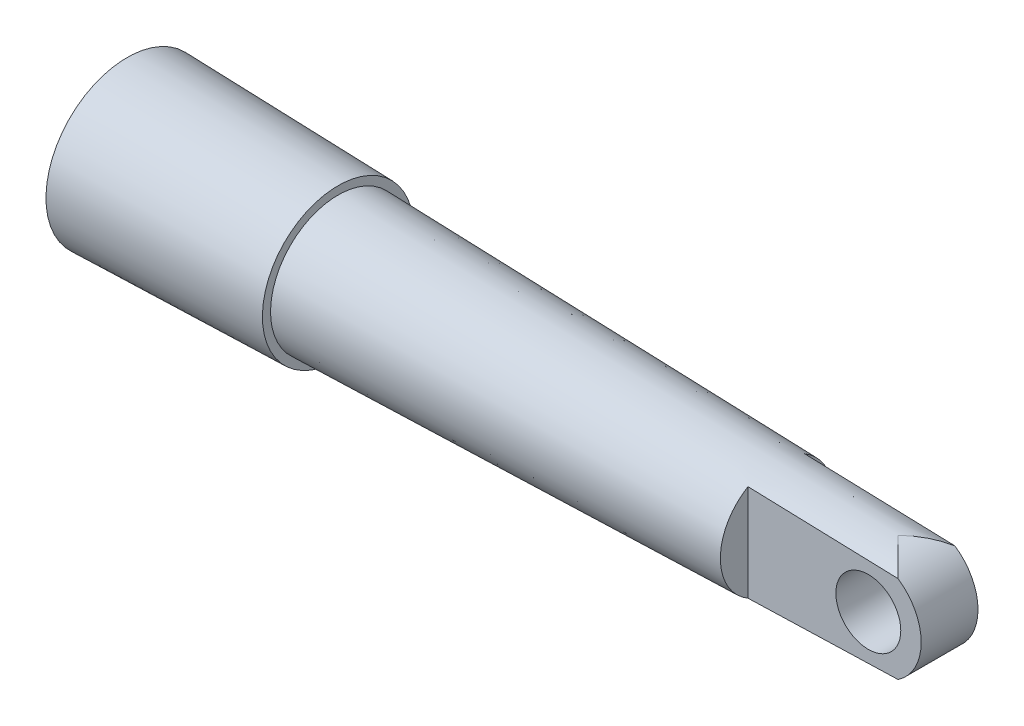
ISO-10303-21;
HEADER;
FILE_DESCRIPTION(('STEP AP214'),'2;1');
FILE_NAME('part.step','',(''),(''),'','','');
FILE_SCHEMA(('AUTOMOTIVE_DESIGN { 1 0 10303 214 1 1 1 1 }'));
ENDSEC;
DATA;
#1=APPLICATION_CONTEXT('core data for automotive mechanical design processes');
#2=APPLICATION_PROTOCOL_DEFINITION('international standard','automotive_design',2000,#1);
#3=PRODUCT_CONTEXT('',#1,'mechanical');
#4=PRODUCT('Part','Part','',(#3));
#5=PRODUCT_RELATED_PRODUCT_CATEGORY('part','',(#4));
#6=PRODUCT_DEFINITION_FORMATION('','',#4);
#7=PRODUCT_DEFINITION_CONTEXT('part definition',#1,'design');
#8=PRODUCT_DEFINITION('design','',#6,#7);
#9=PRODUCT_DEFINITION_SHAPE('','',#8);
#10=(LENGTH_UNIT() NAMED_UNIT(*) SI_UNIT(.MILLI.,.METRE.));
#11=(NAMED_UNIT(*) PLANE_ANGLE_UNIT() SI_UNIT($,.RADIAN.));
#12=(NAMED_UNIT(*) SI_UNIT($,.STERADIAN.) SOLID_ANGLE_UNIT());
#13=UNCERTAINTY_MEASURE_WITH_UNIT(LENGTH_MEASURE(1.E-05),#10,'distance_accuracy_value','');
#14=(GEOMETRIC_REPRESENTATION_CONTEXT(3) GLOBAL_UNCERTAINTY_ASSIGNED_CONTEXT((#13)) GLOBAL_UNIT_ASSIGNED_CONTEXT((#10,
#11,#12)) REPRESENTATION_CONTEXT('',''));
#15=CARTESIAN_POINT('',(0.,0.,0.));
#16=DIRECTION('',(0.,0.,1.));
#17=DIRECTION('',(1.,0.,0.));
#18=AXIS2_PLACEMENT_3D('',#15,#16,#17);
#19=CARTESIAN_POINT('',(214.680253095799,2.11740316674429E-06,12.22375));
#20=DIRECTION('',(0.,0.,-1.));
#21=DIRECTION('',(-1.,0.,0.));
#22=AXIS2_PLACEMENT_3D('',#19,#20,#21);
#23=CYLINDRICAL_SURFACE('',#22,22.7526053836988);
#24=CARTESIAN_POINT('',(215.275846870798,22.744810751496,0.));
#25=CARTESIAN_POINT('',(215.292516964593,22.7443742179673,-0.016675808179666));
#26=CARTESIAN_POINT('',(215.309186970915,22.7439193596647,-0.0333515288556699));
#27=CARTESIAN_POINT('',(216.195441732267,22.7187624061604,-0.919910091753786));
#28=CARTESIAN_POINT('',(217.064723282402,22.6442042631763,-1.78948962522024));
#29=CARTESIAN_POINT('',(218.796628875177,22.394263642131,-3.52198890177359));
#30=CARTESIAN_POINT('',(219.659246400101,22.2187926693635,-4.38490212490919));
#31=CARTESIAN_POINT('',(221.37105489041,21.7646185442929,-6.09729741030723));
#32=CARTESIAN_POINT('',(222.220243368632,21.485896497261,-6.9467769845544));
#33=CARTESIAN_POINT('',(223.896938814489,20.8217668292977,-8.62404718947442));
#34=CARTESIAN_POINT('',(224.724466663386,20.4364664353317,-9.45185870856718));
#35=CARTESIAN_POINT('',(225.869130581133,19.8149747784861,-10.5969150084173));
#36=CARTESIAN_POINT('',(226.199059322254,19.6251130939193,-10.926956846618));
#37=CARTESIAN_POINT('',(226.852569203767,19.2265954831054,-11.5806907464094));
#38=CARTESIAN_POINT('',(227.176159579133,19.0179698332544,-11.9043920461407));
#39=CARTESIAN_POINT('',(227.496507720027,18.7995943776966,-12.2248500000019));
#40=B_SPLINE_CURVE_WITH_KNOTS('',3,(#24,#25,#26,#27,#28,#29,#30,#31,#32,#33,#34,#35,#36,#37,#38,
#39),.UNSPECIFIED.,.F.,.F.,(4,2,2,2,2,2,2,4),(0.,0.0707500968948425,3.76142805801312,
7.45534747589574,11.1499432074378,14.8408352941603,16.3519174812511,17.8606037813329),.UNSPECIFIED.);
#41=CARTESIAN_POINT('',(215.275846870798,22.744810751496,0.));
#42=VERTEX_POINT('',#41);
#43=CARTESIAN_POINT('',(227.495408096968,18.8003439771235,-12.22375));
#44=VERTEX_POINT('',#43);
#45=EDGE_CURVE('E54',#42,#44,#40,.T.);
#46=ORIENTED_EDGE('',*,*,#45,.F.);
#47=CARTESIAN_POINT('',(227.496507720027,18.7995943776966,12.2248500000019));
#48=CARTESIAN_POINT('',(227.202071323263,19.0003099543851,11.9303126728432));
#49=CARTESIAN_POINT('',(226.904857730796,19.1928086847359,11.6329971977144));
#50=CARTESIAN_POINT('',(226.305503820198,19.5616611804873,11.0334378328586));
#51=CARTESIAN_POINT('',(226.003364094235,19.7380168698228,10.7311945355032));
#52=CARTESIAN_POINT('',(225.394843545994,20.0748486288401,10.1224653910109));
#53=CARTESIAN_POINT('',(225.088464568666,20.2353313732255,9.81598138945855));
#54=CARTESIAN_POINT('',(224.471871361768,20.5407821108433,9.19917681918383));
#55=CARTESIAN_POINT('',(224.161657002427,20.6857495775033,8.88885612064636));
#56=CARTESIAN_POINT('',(223.227472706606,21.0971221901962,7.95435159337766));
#57=CARTESIAN_POINT('',(222.598435120176,21.3408368632446,7.32509837758609));
#58=CARTESIAN_POINT('',(221.330543239991,21.7693033683874,6.05677187363116));
#59=CARTESIAN_POINT('',(220.691689300395,21.9540573224799,5.41769893974762));
#60=CARTESIAN_POINT('',(219.269009602288,22.2995379766921,3.9945315576488));
#61=CARTESIAN_POINT('',(218.483515313144,22.4465829993808,3.20876800680162));
#62=CARTESIAN_POINT('',(216.907393999325,22.657284104551,1.63210641050361));
#63=CARTESIAN_POINT('',(216.116770726971,22.7209954636688,0.841212118659444));
#64=CARTESIAN_POINT('',(215.309186988627,22.7439193607071,0.0333515465756447));
#65=CARTESIAN_POINT('',(215.292516982395,22.7443742190715,0.0166758259889187));
#66=CARTESIAN_POINT('',(215.275846870798,22.744810751496,0.));
#67=B_SPLINE_CURVE_WITH_KNOTS('',3,(#47,#48,#49,#50,#51,#52,#53,#54,#55,#56,#57,#58,#59,#60,#61,
#62,#63,#64,#65,#66),.UNSPECIFIED.,.F.,.F.,(4,2,2,2,2,2,2,2,2,4),(0.,1.38680110779044,
2.77343672021115,4.15948673957671,5.54558378513934,8.31084363868493,11.0760039592173,
14.4350205094442,17.7918078350444,17.8625579319393),.UNSPECIFIED.);
#68=CARTESIAN_POINT('',(227.495408096968,18.8003439771235,12.22375));
#69=VERTEX_POINT('',#68);
#70=EDGE_CURVE('E94',#69,#42,#67,.T.);
#71=ORIENTED_EDGE('',*,*,#70,.F.);
#72=CARTESIAN_POINT('',(214.680253095799,2.11740316674429E-06,12.22375));
#73=DIRECTION('',(0.,0.,1.));
#74=DIRECTION('',(-1.,0.,0.));
#75=AXIS2_PLACEMENT_3D('',#72,#73,#74);
#76=CIRCLE('',#75,22.7526053836988);
#77=CARTESIAN_POINT('',(227.495408096968,-18.8003397423172,12.22375));
#78=VERTEX_POINT('',#77);
#79=EDGE_CURVE('E91',#78,#69,#76,.T.);
#80=ORIENTED_EDGE('',*,*,#79,.F.);
#81=CARTESIAN_POINT('',(215.275846870798,-22.7448065166897,0.));
#82=CARTESIAN_POINT('',(215.292516964593,-22.744369983161,0.0166758081796669));
#83=CARTESIAN_POINT('',(215.309186970915,-22.7439151248584,0.0333515288556708));
#84=CARTESIAN_POINT('',(216.195441732267,-22.718758171354,0.91991009175379));
#85=CARTESIAN_POINT('',(217.064723282402,-22.6442000283699,1.78948962522024));
#86=CARTESIAN_POINT('',(218.796628875177,-22.3942594073247,3.52198890177358));
#87=CARTESIAN_POINT('',(219.659246400101,-22.2187884345572,4.38490212490919));
#88=CARTESIAN_POINT('',(221.37105489041,-21.7646143094866,6.09729741030724));
#89=CARTESIAN_POINT('',(222.220243368632,-21.4858922624547,6.94677698455441));
#90=CARTESIAN_POINT('',(223.896938814489,-20.8217625944914,8.62404718947443));
#91=CARTESIAN_POINT('',(224.724466663386,-20.4364622005253,9.45185870856718));
#92=CARTESIAN_POINT('',(225.869130581133,-19.8149705436797,10.5969150084173));
#93=CARTESIAN_POINT('',(226.199059322254,-19.625108859113,10.926956846618));
#94=CARTESIAN_POINT('',(226.852569203767,-19.226591248299,11.5806907464094));
#95=CARTESIAN_POINT('',(227.176159579133,-19.0179655984481,11.9043920461407));
#96=CARTESIAN_POINT('',(227.496507720027,-18.7995901428903,12.2248500000019));
#97=B_SPLINE_CURVE_WITH_KNOTS('',3,(#81,#82,#83,#84,#85,#86,#87,#88,#89,#90,#91,#92,#93,#94,#95,
#96),.UNSPECIFIED.,.F.,.F.,(4,2,2,2,2,2,2,4),(0.,0.0707500968948426,3.76142805801313,
7.45534747589577,11.1499432074378,14.8408352941603,16.3519174812511,17.8606037813329),.UNSPECIFIED.);
#98=CARTESIAN_POINT('',(215.275846870798,-22.7448065166897,0.));
#99=VERTEX_POINT('',#98);
#100=EDGE_CURVE('E161',#99,#78,#97,.T.);
#101=ORIENTED_EDGE('',*,*,#100,.F.);
#102=CARTESIAN_POINT('',(227.496507720027,-18.7995901428903,-12.2248500000019));
#103=CARTESIAN_POINT('',(227.202071323263,-19.0003057195788,-11.9303126728432));
#104=CARTESIAN_POINT('',(226.904857730796,-19.1928044499296,-11.6329971977144));
#105=CARTESIAN_POINT('',(226.305503820198,-19.5616569456809,-11.0334378328586));
#106=CARTESIAN_POINT('',(226.003364094235,-19.7380126350164,-10.7311945355032));
#107=CARTESIAN_POINT('',(225.394843545994,-20.0748443940338,-10.1224653910108));
#108=CARTESIAN_POINT('',(225.088464568666,-20.2353271384192,-9.81598138945853));
#109=CARTESIAN_POINT('',(224.471871361768,-20.540777876037,-9.1991768191838));
#110=CARTESIAN_POINT('',(224.161657002427,-20.6857453426969,-8.88885612064633));
#111=CARTESIAN_POINT('',(223.227472706606,-21.0971179553898,-7.95435159337765));
#112=CARTESIAN_POINT('',(222.598435120176,-21.3408326284382,-7.32509837758608));
#113=CARTESIAN_POINT('',(221.330543239991,-21.769299133581,-6.05677187363116));
#114=CARTESIAN_POINT('',(220.691689300395,-21.9540530876735,-5.41769893974763));
#115=CARTESIAN_POINT('',(219.269009602288,-22.2995337418857,-3.9945315576488));
#116=CARTESIAN_POINT('',(218.483515313144,-22.4465787645745,-3.20876800680162));
#117=CARTESIAN_POINT('',(216.907393999325,-22.6572798697447,-1.63210641050361));
#118=CARTESIAN_POINT('',(216.116770726971,-22.7209912288624,-0.841212118659444));
#119=CARTESIAN_POINT('',(215.309186988627,-22.7439151259008,-0.0333515465756438));
#120=CARTESIAN_POINT('',(215.292516982395,-22.7443699842652,-0.0166758259889177));
#121=CARTESIAN_POINT('',(215.275846870798,-22.7448065166897,0.));
#122=B_SPLINE_CURVE_WITH_KNOTS('',3,(#102,#103,#104,#105,#106,#107,#108,#109,#110,#111,#112,
#113,#114,#115,#116,#117,#118,#119,#120,#121),.UNSPECIFIED.,.F.,.F.,(4,2,2,2,2,2,2,2,2,4),(0.,
1.38680110779045,2.77343672021116,4.15948673957676,5.54558378513938,8.3108436386849,
11.0760039592173,14.4350205094442,17.7918078350444,17.8625579319393),.UNSPECIFIED.);
#123=CARTESIAN_POINT('',(227.495408096968,-18.8003397423178,-12.22375));
#124=VERTEX_POINT('',#123);
#125=EDGE_CURVE('E154',#124,#99,#122,.T.);
#126=ORIENTED_EDGE('',*,*,#125,.F.);
#127=CARTESIAN_POINT('',(214.680253095799,2.11740316674429E-06,-12.22375));
#128=DIRECTION('',(0.,0.,1.));
#129=DIRECTION('',(-1.,0.,0.));
#130=AXIS2_PLACEMENT_3D('',#127,#128,#129);
#131=CIRCLE('',#130,22.7526053836988);
#132=EDGE_CURVE('E114',#124,#44,#131,.T.);
#133=ORIENTED_EDGE('',*,*,#132,.T.);
#134=EDGE_LOOP('',(#46,#71,#80,#101,#126,#133));
#135=FACE_BOUND('',#134,.T.);
#136=ADVANCED_FACE('F38',(#135),#23,.T.);
#137=CARTESIAN_POINT('',(214.680253095799,2.11740316674429E-06,12.22375));
#138=DIRECTION('',(0.,0.,-1.));
#139=DIRECTION('',(-1.,0.,0.));
#140=AXIS2_PLACEMENT_3D('',#137,#138,#139);
#141=PLANE('',#140);
#142=CARTESIAN_POINT('',(214.680253095799,2.11740316674429E-06,12.22375));
#143=DIRECTION('',(0.,0.,1.));
#144=DIRECTION('',(1.,0.,0.));
#145=AXIS2_PLACEMENT_3D('',#142,#143,#144);
#146=CIRCLE('',#145,13.97);
#147=CARTESIAN_POINT('',(228.650253095799,2.11740316674429E-06,12.22375));
#148=VERTEX_POINT('',#147);
#149=EDGE_CURVE('E219',#148,#148,#146,.T.);
#150=ORIENTED_EDGE('',*,*,#149,.F.);
#151=EDGE_LOOP('',(#150));
#152=FACE_BOUND('',#151,.T.);
#153=CARTESIAN_POINT('',(326.206496716202,-15.6270588185035,12.22375));
#154=CARTESIAN_POINT('',(319.765425054451,-15.8411862702129,12.22375));
#155=CARTESIAN_POINT('',(313.324298744216,-16.0536632467429,12.22375));
#156=CARTESIAN_POINT('',(300.44194977192,-16.4756515721448,12.22375));
#157=CARTESIAN_POINT('',(294.00072710987,-16.6851629213934,12.22375));
#158=CARTESIAN_POINT('',(274.676922269461,-17.3097518933099,12.22375));
#159=CARTESIAN_POINT('',(261.79421252564,-17.7208841323191,12.22375));
#160=CARTESIAN_POINT('',(236.028523958604,-18.5346386482024,12.22375));
#161=CARTESIAN_POINT('',(223.145545135371,-18.9372609244923,12.22375));
#162=CARTESIAN_POINT('',(197.379366247762,-19.7354838717071,12.22375));
#163=CARTESIAN_POINT('',(184.49616618332,-20.131084540508,12.22375));
#164=CARTESIAN_POINT('',(158.729586958746,-20.9164106991893,12.22375));
#165=CARTESIAN_POINT('',(145.846207798612,-21.3061361889873,12.22375));
#166=CARTESIAN_POINT('',(123.157816151812,-21.9880792502195,12.22375));
#167=CARTESIAN_POINT('',(113.352835108021,-22.2813440404944,12.22375));
#168=CARTESIAN_POINT('',(93.7428006477436,-22.8653026112537,12.22375));
#169=CARTESIAN_POINT('',(83.9377472312897,-23.1559963928389,12.22375));
#170=CARTESIAN_POINT('',(74.1326605219368,-23.4455606821551,12.22375));
#171=B_SPLINE_CURVE_WITH_KNOTS('',3,(#153,#154,#155,#156,#157,#158,#159,#160,#161,#162,#163,
#164,#165,#166,#167,#168,#169,#170),.UNSPECIFIED.,.F.,.F.,(4,2,2,2,2,2,2,2,4),(0.,
19.3338891832543,38.6677759099801,77.3355772451173,116.003381234626,154.671196919958,
193.339013147403,222.767110236381,252.195194725203),.UNSPECIFIED.);
#172=CARTESIAN_POINT('',(162.906298758641,-20.7886677829929,12.22375));
#173=VERTEX_POINT('',#172);
#174=EDGE_CURVE('E95',#78,#173,#171,.T.);
#175=ORIENTED_EDGE('',*,*,#174,.F.);
#176=ORIENTED_EDGE('',*,*,#79,.T.);
#177=CARTESIAN_POINT('',(74.1326605219368,23.4455649169614,12.22375));
#178=CARTESIAN_POINT('',(82.7176825533052,23.1920352165898,12.22375));
#179=CARTESIAN_POINT('',(91.3026788811673,22.9376348811452,12.22375));
#180=CARTESIAN_POINT('',(108.472611543655,22.4268923913868,12.22375));
#181=CARTESIAN_POINT('',(117.057547878296,22.1705502375755,12.22375));
#182=CARTESIAN_POINT('',(142.356815520011,21.4119662886224,12.22375));
#183=CARTESIAN_POINT('',(159.071057337905,20.9067350576197,12.22375));
#184=CARTESIAN_POINT('',(192.499234003874,19.8862318566805,12.22375));
#185=CARTESIAN_POINT('',(209.213168851969,19.3709598873999,12.22375));
#186=CARTESIAN_POINT('',(234.283781344366,18.5884939415103,12.22375));
#187=CARTESIAN_POINT('',(242.640608186883,18.3260788231319,12.22375));
#188=CARTESIAN_POINT('',(259.354146760132,17.7976123011185,12.22375));
#189=CARTESIAN_POINT('',(267.710858490867,17.531560897576,12.22375));
#190=CARTESIAN_POINT('',(284.424151551973,16.9953076110451,12.22375));
#191=CARTESIAN_POINT('',(292.780732882302,16.7251057267558,12.22375));
#192=CARTESIAN_POINT('',(309.49373872915,16.1798743686467,12.22375));
#193=CARTESIAN_POINT('',(317.850163245655,15.9048448943982,12.22375));
#194=CARTESIAN_POINT('',(326.206496716202,15.6270630533098,12.22375));
#195=B_SPLINE_CURVE_WITH_KNOTS('',3,(#177,#178,#179,#180,#181,#182,#183,#184,#185,#186,#187,
#188,#189,#190,#191,#192,#193,#194),.UNSPECIFIED.,.F.,.F.,(4,2,2,2,2,2,2,2,4),(0.,
25.7662943110249,51.5325819539579,101.698207698208,151.863830164842,176.946667261417,
202.029503720248,227.112348040924,252.195194588747),.UNSPECIFIED.);
#196=CARTESIAN_POINT('',(162.906298758641,20.7886720177992,12.22375));
#197=VERTEX_POINT('',#196);
#198=EDGE_CURVE('E85',#197,#69,#195,.T.);
#199=ORIENTED_EDGE('',*,*,#198,.F.);
#200=DIRECTION('',(0.,-1.,0.));
#201=VECTOR('',#200,1.);
#202=CARTESIAN_POINT('',(162.906298758641,-24.116151396168,12.22375));
#203=LINE('',#202,#201);
#204=EDGE_CURVE('E89',#197,#173,#203,.T.);
#205=ORIENTED_EDGE('',*,*,#204,.T.);
#206=EDGE_LOOP('',(#175,#176,#199,#205));
#207=FACE_BOUND('',#206,.T.);
#208=ADVANCED_FACE('F88',(#152,#207),#141,.F.);
#209=CARTESIAN_POINT('',(214.680253095799,2.11740316674429E-06,-12.22375));
#210=DIRECTION('',(0.,0.,-1.));
#211=DIRECTION('',(-1.,0.,0.));
#212=AXIS2_PLACEMENT_3D('',#209,#210,#211);
#213=PLANE('',#212);
#214=CARTESIAN_POINT('',(214.680253095799,2.11740316674429E-06,-12.22375));
#215=DIRECTION('',(0.,0.,-1.));
#216=DIRECTION('',(-1.,0.,0.));
#217=AXIS2_PLACEMENT_3D('',#214,#215,#216);
#218=CIRCLE('',#217,13.97);
#219=CARTESIAN_POINT('',(200.710253095799,2.11740316674429E-06,-12.22375));
#220=VERTEX_POINT('',#219);
#221=EDGE_CURVE('E42',#220,#220,#218,.T.);
#222=ORIENTED_EDGE('',*,*,#221,.F.);
#223=EDGE_LOOP('',(#222));
#224=FACE_BOUND('',#223,.T.);
#225=ORIENTED_EDGE('',*,*,#132,.F.);
#226=CARTESIAN_POINT('',(326.206496716202,-15.6270588185035,-12.22375));
#227=CARTESIAN_POINT('',(319.765425054451,-15.8411862702129,-12.22375));
#228=CARTESIAN_POINT('',(313.324298744216,-16.0536632467429,-12.22375));
#229=CARTESIAN_POINT('',(300.44194977192,-16.4756515721448,-12.22375));
#230=CARTESIAN_POINT('',(294.00072710987,-16.6851629213934,-12.22375));
#231=CARTESIAN_POINT('',(274.676922269461,-17.3097518933099,-12.22375));
#232=CARTESIAN_POINT('',(261.79421252564,-17.7208841323191,-12.22375));
#233=CARTESIAN_POINT('',(236.028523958604,-18.5346386482024,-12.22375));
#234=CARTESIAN_POINT('',(223.145545135371,-18.9372609244923,-12.22375));
#235=CARTESIAN_POINT('',(197.379366247762,-19.7354838717071,-12.22375));
#236=CARTESIAN_POINT('',(184.49616618332,-20.131084540508,-12.22375));
#237=CARTESIAN_POINT('',(158.729586958746,-20.9164106991893,-12.22375));
#238=CARTESIAN_POINT('',(145.846207798612,-21.3061361889873,-12.22375));
#239=CARTESIAN_POINT('',(123.157816151812,-21.9880792502195,-12.22375));
#240=CARTESIAN_POINT('',(113.352835108021,-22.2813440404944,-12.22375));
#241=CARTESIAN_POINT('',(93.7428006477436,-22.8653026112537,-12.22375));
#242=CARTESIAN_POINT('',(83.9377472312897,-23.1559963928389,-12.22375));
#243=CARTESIAN_POINT('',(74.1326605219368,-23.4455606821551,-12.22375));
#244=B_SPLINE_CURVE_WITH_KNOTS('',3,(#226,#227,#228,#229,#230,#231,#232,#233,#234,#235,#236,
#237,#238,#239,#240,#241,#242,#243),.UNSPECIFIED.,.F.,.F.,(4,2,2,2,2,2,2,2,4),(0.,
19.3338891832543,38.6677759099801,77.3355772451173,116.003381234626,154.671196919958,
193.339013147403,222.767110236381,252.195194725203),.UNSPECIFIED.);
#245=CARTESIAN_POINT('',(162.906298758641,-20.7886677829929,-12.22375));
#246=VERTEX_POINT('',#245);
#247=EDGE_CURVE('E11',#124,#246,#244,.T.);
#248=ORIENTED_EDGE('',*,*,#247,.T.);
#249=DIRECTION('',(0.,-1.,0.));
#250=VECTOR('',#249,1.);
#251=CARTESIAN_POINT('',(162.906298758641,-24.116151396168,-12.22375));
#252=LINE('',#251,#250);
#253=CARTESIAN_POINT('',(162.906298758641,20.7886720177992,-12.22375));
#254=VERTEX_POINT('',#253);
#255=EDGE_CURVE('E101',#254,#246,#252,.T.);
#256=ORIENTED_EDGE('',*,*,#255,.F.);
#257=CARTESIAN_POINT('',(74.1326605219368,23.4455649169614,-12.22375));
#258=CARTESIAN_POINT('',(82.7176825533052,23.1920352165898,-12.22375));
#259=CARTESIAN_POINT('',(91.3026788811673,22.9376348811452,-12.22375));
#260=CARTESIAN_POINT('',(108.472611543655,22.4268923913868,-12.22375));
#261=CARTESIAN_POINT('',(117.057547878296,22.1705502375755,-12.22375));
#262=CARTESIAN_POINT('',(142.356815520011,21.4119662886224,-12.22375));
#263=CARTESIAN_POINT('',(159.071057337905,20.9067350576197,-12.22375));
#264=CARTESIAN_POINT('',(192.499234003874,19.8862318566805,-12.22375));
#265=CARTESIAN_POINT('',(209.213168851969,19.3709598873999,-12.22375));
#266=CARTESIAN_POINT('',(234.283781344366,18.5884939415103,-12.22375));
#267=CARTESIAN_POINT('',(242.640608186883,18.3260788231319,-12.22375));
#268=CARTESIAN_POINT('',(259.354146760132,17.7976123011185,-12.22375));
#269=CARTESIAN_POINT('',(267.710858490867,17.531560897576,-12.22375));
#270=CARTESIAN_POINT('',(284.424151551973,16.9953076110451,-12.22375));
#271=CARTESIAN_POINT('',(292.780732882302,16.7251057267558,-12.22375));
#272=CARTESIAN_POINT('',(309.49373872915,16.1798743686467,-12.22375));
#273=CARTESIAN_POINT('',(317.850163245655,15.9048448943982,-12.22375));
#274=CARTESIAN_POINT('',(326.206496716202,15.6270630533098,-12.22375));
#275=B_SPLINE_CURVE_WITH_KNOTS('',3,(#257,#258,#259,#260,#261,#262,#263,#264,#265,#266,#267,
#268,#269,#270,#271,#272,#273,#274),.UNSPECIFIED.,.F.,.F.,(4,2,2,2,2,2,2,2,4),(0.,
25.7662943110249,51.5325819539579,101.698207698208,151.863830164842,176.946667261417,
202.029503720248,227.112348040924,252.195194588747),.UNSPECIFIED.);
#276=EDGE_CURVE('E47',#254,#44,#275,.T.);
#277=ORIENTED_EDGE('',*,*,#276,.T.);
#278=EDGE_LOOP('',(#225,#248,#256,#277));
#279=FACE_BOUND('',#278,.T.);
#280=ADVANCED_FACE('F131',(#224,#279),#213,.T.);
#281=CARTESIAN_POINT('',(162.906298758641,24.1161556309744,0.));
#282=DIRECTION('',(-1.,0.,0.));
#283=DIRECTION('',(0.,-1.,0.));
#284=AXIS2_PLACEMENT_3D('',#281,#282,#283);
#285=PLANE('',#284);
#286=ORIENTED_EDGE('',*,*,#204,.F.);
#287=CARTESIAN_POINT('',(162.906298758641,2.11740316931054E-06,0.));
#288=DIRECTION('',(-1.,0.,0.));
#289=DIRECTION('',(0.,-1.,0.));
#290=AXIS2_PLACEMENT_3D('',#287,#288,#289);
#291=CIRCLE('',#290,24.1161535135712);
#292=EDGE_CURVE('E100',#173,#197,#291,.T.);
#293=ORIENTED_EDGE('',*,*,#292,.F.);
#294=EDGE_LOOP('',(#286,#293));
#295=FACE_BOUND('',#294,.T.);
#296=ADVANCED_FACE('F99',(#295),#285,.F.);
#297=CARTESIAN_POINT('',(-116.493701241359,2.11740316674429E-06,0.));
#298=DIRECTION('',(1.,0.,0.));
#299=DIRECTION('',(0.,1.,0.));
#300=AXIS2_PLACEMENT_3D('',#297,#298,#299);
#301=PLANE('',#300);
#302=CARTESIAN_POINT('',(-116.493701241359,2.11740316674429E-06,0.));
#303=DIRECTION('',(-1.,0.,0.));
#304=DIRECTION('',(0.,0.,1.));
#305=AXIS2_PLACEMENT_3D('',#302,#303,#304);
#306=CIRCLE('',#305,15.71625);
#307=CARTESIAN_POINT('',(-116.493701241359,2.11740316674429E-06,15.71625));
#308=VERTEX_POINT('',#307);
#309=EDGE_CURVE('E214',#308,#308,#306,.T.);
#310=ORIENTED_EDGE('',*,*,#309,.F.);
#311=EDGE_LOOP('',(#310));
#312=FACE_BOUND('',#311,.T.);
#313=CARTESIAN_POINT('',(-116.493701241359,2.11740316674429E-06,0.));
#314=DIRECTION('',(-1.,0.,0.));
#315=DIRECTION('',(0.,-1.,0.));
#316=AXIS2_PLACEMENT_3D('',#313,#314,#315);
#317=CIRCLE('',#316,34.925);
#318=CARTESIAN_POINT('',(-116.493701241359,-34.9249978825968,0.));
#319=VERTEX_POINT('',#318);
#320=EDGE_CURVE('E102',#319,#319,#317,.T.);
#321=ORIENTED_EDGE('',*,*,#320,.T.);
#322=EDGE_LOOP('',(#321));
#323=FACE_BOUND('',#322,.T.);
#324=ADVANCED_FACE('F40',(#312,#323),#301,.F.);
#325=CARTESIAN_POINT('',(-25.7198178469538,2.11740316757803E-06,0.));
#326=DIRECTION('',(-1.,0.,0.));
#327=DIRECTION('',(0.,-1.,0.));
#328=AXIS2_PLACEMENT_3D('',#325,#326,#327);
#329=CONICAL_SURFACE('',#328,32.5480022089042,0.0261799387799077);
#330=ORIENTED_EDGE('',*,*,#320,.F.);
#331=EDGE_LOOP('',(#330));
#332=FACE_BOUND('',#331,.T.);
#333=CARTESIAN_POINT('',(-25.7198178469538,2.11740316757803E-06,0.));
#334=DIRECTION('',(-1.,0.,0.));
#335=DIRECTION('',(0.,-1.,0.));
#336=AXIS2_PLACEMENT_3D('',#333,#334,#335);
#337=CIRCLE('',#336,32.5480022089042);
#338=CARTESIAN_POINT('',(-25.7198178469538,-32.5480000915011,0.));
#339=VERTEX_POINT('',#338);
#340=EDGE_CURVE('E110',#339,#339,#337,.T.);
#341=ORIENTED_EDGE('',*,*,#340,.T.);
#342=EDGE_LOOP('',(#341));
#343=FACE_BOUND('',#342,.T.);
#344=ADVANCED_FACE('F195',(#332,#343),#329,.T.);
#345=CARTESIAN_POINT('',(-25.7198178469538,32.5480043263074,0.));
#346=DIRECTION('',(-1.,0.,0.));
#347=DIRECTION('',(0.,-1.,0.));
#348=AXIS2_PLACEMENT_3D('',#345,#346,#347);
#349=PLANE('',#348);
#350=ORIENTED_EDGE('',*,*,#340,.F.);
#351=EDGE_LOOP('',(#350));
#352=FACE_BOUND('',#351,.T.);
#353=CARTESIAN_POINT('',(-25.7198178469538,2.11740316757803E-06,0.));
#354=DIRECTION('',(-1.,0.,0.));
#355=DIRECTION('',(0.,-1.,0.));
#356=AXIS2_PLACEMENT_3D('',#353,#354,#355);
#357=CIRCLE('',#356,29.0555022089042);
#358=CARTESIAN_POINT('',(-25.7198178469538,-29.0555000915011,0.));
#359=VERTEX_POINT('',#358);
#360=EDGE_CURVE('E106',#359,#359,#357,.T.);
#361=ORIENTED_EDGE('',*,*,#360,.T.);
#362=EDGE_LOOP('',(#361));
#363=FACE_BOUND('',#362,.T.);
#364=ADVANCED_FACE('F193',(#352,#363),#349,.F.);
#365=CARTESIAN_POINT('',(162.906298758641,2.11740316931054E-06,0.));
#366=DIRECTION('',(-1.,0.,0.));
#367=DIRECTION('',(0.,-1.,0.));
#368=AXIS2_PLACEMENT_3D('',#365,#366,#367);
#369=CONICAL_SURFACE('',#368,24.1161535135712,0.0261799387799078);
#370=ORIENTED_EDGE('',*,*,#174,.T.);
#371=ORIENTED_EDGE('',*,*,#292,.T.);
#372=ORIENTED_EDGE('',*,*,#198,.T.);
#373=ORIENTED_EDGE('',*,*,#70,.T.);
#374=ORIENTED_EDGE('',*,*,#45,.T.);
#375=ORIENTED_EDGE('',*,*,#276,.F.);
#376=EDGE_CURVE('E107',#254,#246,#291,.T.);
#377=ORIENTED_EDGE('',*,*,#376,.T.);
#378=ORIENTED_EDGE('',*,*,#247,.F.);
#379=ORIENTED_EDGE('',*,*,#125,.T.);
#380=ORIENTED_EDGE('',*,*,#100,.T.);
#381=EDGE_LOOP('',(#370,#371,#372,#373,#374,#375,#377,#378,#379,#380));
#382=FACE_BOUND('',#381,.T.);
#383=ORIENTED_EDGE('',*,*,#360,.F.);
#384=EDGE_LOOP('',(#383));
#385=FACE_BOUND('',#384,.T.);
#386=ADVANCED_FACE('F104',(#382,#385),#369,.T.);
#387=ORIENTED_EDGE('',*,*,#376,.F.);
#388=ORIENTED_EDGE('',*,*,#255,.T.);
#389=EDGE_LOOP('',(#387,#388));
#390=FACE_BOUND('',#389,.T.);
#391=ADVANCED_FACE('F184',(#390),#285,.F.);
#392=CARTESIAN_POINT('',(214.680253095799,2.11740316674429E-06,-34.925));
#393=DIRECTION('',(0.,0.,1.));
#394=DIRECTION('',(1.,0.,0.));
#395=AXIS2_PLACEMENT_3D('',#392,#393,#394);
#396=CYLINDRICAL_SURFACE('',#395,13.97);
#397=ORIENTED_EDGE('',*,*,#221,.T.);
#398=EDGE_LOOP('',(#397));
#399=FACE_BOUND('',#398,.T.);
#400=ORIENTED_EDGE('',*,*,#149,.T.);
#401=EDGE_LOOP('',(#400));
#402=FACE_BOUND('',#401,.T.);
#403=ADVANCED_FACE('F137',(#399,#402),#396,.F.);
#404=CARTESIAN_POINT('',(93.0562987586407,2.11740316674429E-06,0.));
#405=DIRECTION('',(-1.,0.,0.));
#406=DIRECTION('',(0.,0.,1.));
#407=AXIS2_PLACEMENT_3D('',#404,#405,#406);
#408=CYLINDRICAL_SURFACE('',#407,15.71625);
#409=CARTESIAN_POINT('',(93.0562987586407,2.11740316674429E-06,0.));
#410=DIRECTION('',(-1.,0.,0.));
#411=DIRECTION('',(0.,0.,1.));
#412=AXIS2_PLACEMENT_3D('',#409,#410,#411);
#413=CIRCLE('',#412,15.71625);
#414=CARTESIAN_POINT('',(93.0562987586407,2.11740316674429E-06,15.71625));
#415=VERTEX_POINT('',#414);
#416=EDGE_CURVE('E216',#415,#415,#413,.T.);
#417=CARTESIAN_POINT('',(93.0562987586407,2.11740316674429E-06,15.71625));
#418=CARTESIAN_POINT('',(90.8734862586407,2.11740316674429E-06,15.71625));
#419=CARTESIAN_POINT('',(88.6906737586407,2.11740316674429E-06,15.71625));
#420=CARTESIAN_POINT('',(84.3250487586407,2.11740316674429E-06,15.71625));
#421=CARTESIAN_POINT('',(82.1422362586407,2.11740316674429E-06,15.71625));
#422=CARTESIAN_POINT('',(77.7766112586407,2.11740316674429E-06,15.71625));
#423=CARTESIAN_POINT('',(75.5937987586407,2.11740316674429E-06,15.71625));
#424=CARTESIAN_POINT('',(71.2281737586407,2.11740316674429E-06,15.71625));
#425=CARTESIAN_POINT('',(69.0453612586407,2.11740316674429E-06,15.71625));
#426=CARTESIAN_POINT('',(64.6797362586407,2.11740316674429E-06,15.71625));
#427=CARTESIAN_POINT('',(62.4969237586407,2.11740316674429E-06,15.71625));
#428=CARTESIAN_POINT('',(58.1312987586407,2.11740316674429E-06,15.71625));
#429=CARTESIAN_POINT('',(55.9484862586407,2.11740316674429E-06,15.71625));
#430=CARTESIAN_POINT('',(51.5828612586407,2.11740316674429E-06,15.71625));
#431=CARTESIAN_POINT('',(49.4000487586407,2.11740316674429E-06,15.71625));
#432=CARTESIAN_POINT('',(45.0344237586407,2.11740316674429E-06,15.71625));
#433=CARTESIAN_POINT('',(42.8516112586407,2.11740316674429E-06,15.71625));
#434=CARTESIAN_POINT('',(38.4859862586407,2.11740316674429E-06,15.71625));
#435=CARTESIAN_POINT('',(36.3031737586407,2.11740316674429E-06,15.71625));
#436=CARTESIAN_POINT('',(31.9375487586407,2.11740316674429E-06,15.71625));
#437=CARTESIAN_POINT('',(29.7547362586407,2.11740316674429E-06,15.71625));
#438=CARTESIAN_POINT('',(25.3891112586407,2.11740316674429E-06,15.71625));
#439=CARTESIAN_POINT('',(23.2062987586408,2.11740316674429E-06,15.71625));
#440=CARTESIAN_POINT('',(18.8406737586408,2.11740316674429E-06,15.71625));
#441=CARTESIAN_POINT('',(16.6578612586408,2.11740316674429E-06,15.71625));
#442=CARTESIAN_POINT('',(12.2922362586408,2.11740316674429E-06,15.71625));
#443=CARTESIAN_POINT('',(10.1094237586407,2.11740316674429E-06,15.71625));
#444=CARTESIAN_POINT('',(5.74379875864075,2.11740316674429E-06,15.71625));
#445=CARTESIAN_POINT('',(3.56098625864075,2.11740316674429E-06,15.71625));
#446=CARTESIAN_POINT('',(-0.804638741359243,2.11740316674429E-06,15.71625));
#447=CARTESIAN_POINT('',(-2.98745124135925,2.11740316674429E-06,15.71625));
#448=CARTESIAN_POINT('',(-7.35307624135925,2.11740316674429E-06,15.71625));
#449=CARTESIAN_POINT('',(-9.53588874135925,2.11740316674429E-06,15.71625));
#450=CARTESIAN_POINT('',(-13.9015137413593,2.11740316674429E-06,15.71625));
#451=CARTESIAN_POINT('',(-16.0843262413593,2.11740316674429E-06,15.71625));
#452=CARTESIAN_POINT('',(-20.4499512413593,2.11740316674429E-06,15.71625));
#453=CARTESIAN_POINT('',(-22.6327637413593,2.11740316674429E-06,15.71625));
#454=CARTESIAN_POINT('',(-26.9983887413593,2.11740316674429E-06,15.71625));
#455=CARTESIAN_POINT('',(-29.1812012413593,2.11740316674429E-06,15.71625));
#456=CARTESIAN_POINT('',(-33.5468262413593,2.11740316674429E-06,15.71625));
#457=CARTESIAN_POINT('',(-35.7296387413593,2.11740316674429E-06,15.71625));
#458=CARTESIAN_POINT('',(-40.0952637413593,2.11740316674429E-06,15.71625));
#459=CARTESIAN_POINT('',(-42.2780762413593,2.11740316674429E-06,15.71625));
#460=CARTESIAN_POINT('',(-46.6437012413592,2.11740316674429E-06,15.71625));
#461=CARTESIAN_POINT('',(-48.8265137413592,2.11740316674429E-06,15.71625));
#462=CARTESIAN_POINT('',(-53.1921387413592,2.11740316674429E-06,15.71625));
#463=CARTESIAN_POINT('',(-55.3749512413592,2.11740316674429E-06,15.71625));
#464=CARTESIAN_POINT('',(-59.7405762413592,2.11740316674429E-06,15.71625));
#465=CARTESIAN_POINT('',(-61.9233887413593,2.11740316674429E-06,15.71625));
#466=CARTESIAN_POINT('',(-66.2890137413593,2.11740316674429E-06,15.71625));
#467=CARTESIAN_POINT('',(-68.4718262413593,2.11740316674429E-06,15.71625));
#468=CARTESIAN_POINT('',(-72.8374512413593,2.11740316674429E-06,15.71625));
#469=CARTESIAN_POINT('',(-75.0202637413593,2.11740316674429E-06,15.71625));
#470=CARTESIAN_POINT('',(-79.3858887413593,2.11740316674429E-06,15.71625));
#471=CARTESIAN_POINT('',(-81.5687012413593,2.11740316674429E-06,15.71625));
#472=CARTESIAN_POINT('',(-85.9343262413593,2.11740316674429E-06,15.71625));
#473=CARTESIAN_POINT('',(-88.1171387413593,2.11740316674429E-06,15.71625));
#474=CARTESIAN_POINT('',(-92.4827637413592,2.11740316674429E-06,15.71625));
#475=CARTESIAN_POINT('',(-94.6655762413592,2.11740316674429E-06,15.71625));
#476=CARTESIAN_POINT('',(-99.0312012413593,2.11740316674429E-06,15.71625));
#477=CARTESIAN_POINT('',(-101.214013741359,2.11740316674429E-06,15.71625));
#478=CARTESIAN_POINT('',(-105.579638741359,2.11740316674429E-06,15.71625));
#479=CARTESIAN_POINT('',(-107.762451241359,2.11740316674429E-06,15.71625));
#480=CARTESIAN_POINT('',(-112.128076241359,2.11740316674429E-06,15.71625));
#481=CARTESIAN_POINT('',(-114.310888741359,2.11740316674429E-06,15.71625));
#482=CARTESIAN_POINT('',(-116.493701241359,2.11740316674429E-06,15.71625));
#483=B_SPLINE_CURVE_WITH_KNOTS('',3,(#417,#418,#419,#420,#421,#422,#423,#424,#425,#426,#427,
#428,#429,#430,#431,#432,#433,#434,#435,#436,#437,#438,#439,#440,#441,#442,#443,#444,#445,#446,
#447,#448,#449,#450,#451,#452,#453,#454,#455,#456,#457,#458,#459,#460,#461,#462,#463,#464,#465,
#466,#467,#468,#469,#470,#471,#472,#473,#474,#475,#476,#477,#478,#479,#480,#481,#482),
.UNSPECIFIED.,.F.,.F.,(4,2,2,2,2,2,2,2,2,2,2,2,2,2,2,2,2,2,2,2,2,2,2,2,2,2,2,2,2,2,2,2,4),(0.,
6.5484375,13.096875,19.6453125,26.19375,32.7421875,39.290625,45.8390625,52.3875,58.9359375,
65.484375,72.0328125,78.58125,85.1296875,91.678125,98.2265625,104.775,111.3234375,117.871875,
124.4203125,130.96875,137.5171875,144.065625,150.6140625,157.1625,163.7109375,170.259375,
176.8078125,183.35625,189.9046875,196.453125,203.0015625,209.55),.UNSPECIFIED.);
#484=EDGE_CURVE('BSEAM273',#415,#308,#483,.T.);
#485=ORIENTED_EDGE('',*,*,#416,.F.);
#486=ORIENTED_EDGE('',*,*,#309,.T.);
#487=ORIENTED_EDGE('',*,*,#484,.T.);
#488=ORIENTED_EDGE('',*,*,#484,.F.);
#489=EDGE_LOOP('',(#485,#487,#486,#488));
#490=FACE_BOUND('',#489,.T.);
#491=ADVANCED_FACE('F273',(#490),#408,.F.);
#492=CARTESIAN_POINT('',(93.0562987586407,2.11740316674429E-06,0.));
#493=DIRECTION('',(-1.,0.,0.));
#494=DIRECTION('',(0.,0.,1.));
#495=AXIS2_PLACEMENT_3D('',#492,#493,#494);
#496=PLANE('',#495);
#497=ORIENTED_EDGE('',*,*,#416,.T.);
#498=EDGE_LOOP('',(#497));
#499=FACE_BOUND('',#498,.T.);
#500=ADVANCED_FACE('F282',(#499),#496,.T.);
#501=CLOSED_SHELL('',(#136,#208,#280,#296,#324,#344,#364,#386,#391,#403,#491,#500));
#502=MANIFOLD_SOLID_BREP('B2',#501);
#503=ADVANCED_BREP_SHAPE_REPRESENTATION('',(#18,#502),#14);
#504=SHAPE_DEFINITION_REPRESENTATION(#9,#503);
ENDSEC;
END-ISO-10303-21;
